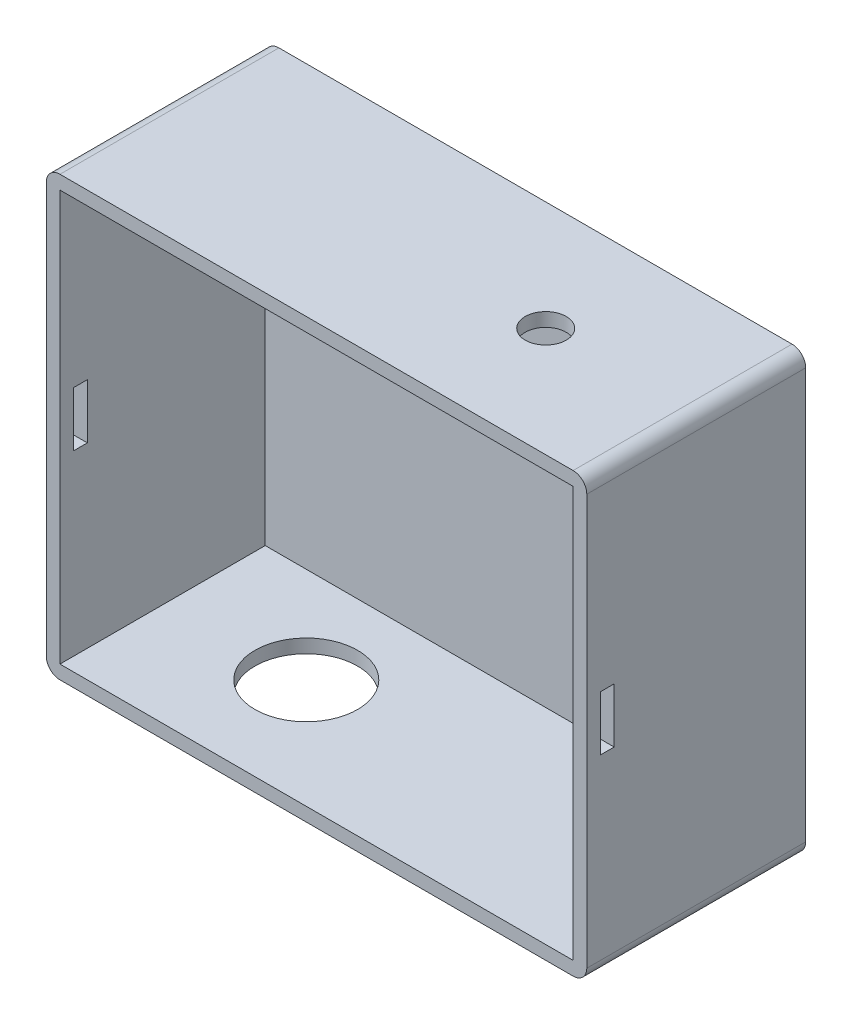
ISO-10303-21;
HEADER;
FILE_DESCRIPTION(('STEP AP214'),'2;1');
FILE_NAME('part.step','',(''),(''),'','','');
FILE_SCHEMA(('AUTOMOTIVE_DESIGN { 1 0 10303 214 1 1 1 1 }'));
ENDSEC;
DATA;
#1=APPLICATION_CONTEXT('core data for automotive mechanical design processes');
#2=APPLICATION_PROTOCOL_DEFINITION('international standard','automotive_design',2000,#1);
#3=PRODUCT_CONTEXT('',#1,'mechanical');
#4=PRODUCT('Part','Part','',(#3));
#5=PRODUCT_RELATED_PRODUCT_CATEGORY('part','',(#4));
#6=PRODUCT_DEFINITION_FORMATION('','',#4);
#7=PRODUCT_DEFINITION_CONTEXT('part definition',#1,'design');
#8=PRODUCT_DEFINITION('design','',#6,#7);
#9=PRODUCT_DEFINITION_SHAPE('','',#8);
#10=(LENGTH_UNIT() NAMED_UNIT(*) SI_UNIT(.MILLI.,.METRE.));
#11=(NAMED_UNIT(*) PLANE_ANGLE_UNIT() SI_UNIT($,.RADIAN.));
#12=(NAMED_UNIT(*) SI_UNIT($,.STERADIAN.) SOLID_ANGLE_UNIT());
#13=UNCERTAINTY_MEASURE_WITH_UNIT(LENGTH_MEASURE(1.E-05),#10,'distance_accuracy_value','');
#14=(GEOMETRIC_REPRESENTATION_CONTEXT(3) GLOBAL_UNCERTAINTY_ASSIGNED_CONTEXT((#13)) GLOBAL_UNIT_ASSIGNED_CONTEXT((#10,
#11,#12)) REPRESENTATION_CONTEXT('',''));
#15=CARTESIAN_POINT('',(0.,0.,0.));
#16=DIRECTION('',(0.,0.,1.));
#17=DIRECTION('',(1.,0.,0.));
#18=AXIS2_PLACEMENT_3D('',#15,#16,#17);
#19=CARTESIAN_POINT('',(0.,0.,30.));
#20=DIRECTION('',(0.,0.,1.));
#21=DIRECTION('',(1.,0.,0.));
#22=AXIS2_PLACEMENT_3D('',#19,#20,#21);
#23=PLANE('',#22);
#24=DIRECTION('',(0.,-1.,0.));
#25=VECTOR('',#24,1.);
#26=CARTESIAN_POINT('',(-39.5,-32.,30.));
#27=LINE('',#26,#25);
#28=CARTESIAN_POINT('',(-39.5,30.,30.));
#29=VERTEX_POINT('',#28);
#30=CARTESIAN_POINT('',(-39.5,-30.,30.));
#31=VERTEX_POINT('',#30);
#32=EDGE_CURVE('E301',#29,#31,#27,.T.);
#33=ORIENTED_EDGE('',*,*,#32,.T.);
#34=CARTESIAN_POINT('',(-37.5,-30.,30.));
#35=DIRECTION('',(0.,0.,1.));
#36=DIRECTION('',(1.,0.,0.));
#37=AXIS2_PLACEMENT_3D('',#34,#35,#36);
#38=CIRCLE('',#37,2.);
#39=CARTESIAN_POINT('',(-37.5,-32.,30.));
#40=VERTEX_POINT('',#39);
#41=EDGE_CURVE('E336',#31,#40,#38,.T.);
#42=ORIENTED_EDGE('',*,*,#41,.T.);
#43=DIRECTION('',(1.,0.,0.));
#44=VECTOR('',#43,1.);
#45=CARTESIAN_POINT('',(-39.5,-32.,30.));
#46=LINE('',#45,#44);
#47=CARTESIAN_POINT('',(37.5,-32.,30.));
#48=VERTEX_POINT('',#47);
#49=EDGE_CURVE('E294',#40,#48,#46,.T.);
#50=ORIENTED_EDGE('',*,*,#49,.T.);
#51=CARTESIAN_POINT('',(37.5,-30.,30.));
#52=DIRECTION('',(0.,0.,1.));
#53=DIRECTION('',(1.,0.,0.));
#54=AXIS2_PLACEMENT_3D('',#51,#52,#53);
#55=CIRCLE('',#54,2.);
#56=CARTESIAN_POINT('',(39.5,-30.,30.));
#57=VERTEX_POINT('',#56);
#58=EDGE_CURVE('E334',#48,#57,#55,.T.);
#59=ORIENTED_EDGE('',*,*,#58,.T.);
#60=DIRECTION('',(0.,1.,0.));
#61=VECTOR('',#60,1.);
#62=CARTESIAN_POINT('',(39.5,-32.,30.));
#63=LINE('',#62,#61);
#64=CARTESIAN_POINT('',(39.5,30.,30.));
#65=VERTEX_POINT('',#64);
#66=EDGE_CURVE('E297',#57,#65,#63,.T.);
#67=ORIENTED_EDGE('',*,*,#66,.T.);
#68=CARTESIAN_POINT('',(37.5,30.,30.));
#69=DIRECTION('',(0.,0.,1.));
#70=DIRECTION('',(1.,0.,0.));
#71=AXIS2_PLACEMENT_3D('',#68,#69,#70);
#72=CIRCLE('',#71,2.);
#73=CARTESIAN_POINT('',(37.5,32.,30.));
#74=VERTEX_POINT('',#73);
#75=EDGE_CURVE('E62',#65,#74,#72,.T.);
#76=ORIENTED_EDGE('',*,*,#75,.T.);
#77=DIRECTION('',(-1.,0.,0.));
#78=VECTOR('',#77,1.);
#79=CARTESIAN_POINT('',(-39.5,32.,30.));
#80=LINE('',#79,#78);
#81=CARTESIAN_POINT('',(-37.5,32.,30.));
#82=VERTEX_POINT('',#81);
#83=EDGE_CURVE('E299',#74,#82,#80,.T.);
#84=ORIENTED_EDGE('',*,*,#83,.T.);
#85=CARTESIAN_POINT('',(-37.5,30.,30.));
#86=DIRECTION('',(0.,0.,1.));
#87=DIRECTION('',(1.,0.,0.));
#88=AXIS2_PLACEMENT_3D('',#85,#86,#87);
#89=CIRCLE('',#88,2.);
#90=EDGE_CURVE('E332',#82,#29,#89,.T.);
#91=ORIENTED_EDGE('',*,*,#90,.T.);
#92=EDGE_LOOP('',(#33,#42,#50,#59,#67,#76,#84,#91));
#93=FACE_BOUND('',#92,.T.);
#94=DIRECTION('',(-1.,0.,0.));
#95=VECTOR('',#94,1.);
#96=CARTESIAN_POINT('',(-37.5,30.,30.));
#97=LINE('',#96,#95);
#98=CARTESIAN_POINT('',(37.5,30.,30.));
#99=VERTEX_POINT('',#98);
#100=CARTESIAN_POINT('',(-37.5,30.,30.));
#101=VERTEX_POINT('',#100);
#102=EDGE_CURVE('E267',#99,#101,#97,.T.);
#103=ORIENTED_EDGE('',*,*,#102,.F.);
#104=DIRECTION('',(0.,1.,0.));
#105=VECTOR('',#104,1.);
#106=CARTESIAN_POINT('',(37.5,-30.,30.));
#107=LINE('',#106,#105);
#108=CARTESIAN_POINT('',(37.5,-30.,30.));
#109=VERTEX_POINT('',#108);
#110=EDGE_CURVE('E265',#109,#99,#107,.T.);
#111=ORIENTED_EDGE('',*,*,#110,.F.);
#112=DIRECTION('',(1.,0.,0.));
#113=VECTOR('',#112,1.);
#114=CARTESIAN_POINT('',(-37.5,-30.,30.));
#115=LINE('',#114,#113);
#116=CARTESIAN_POINT('',(-37.5,-30.,30.));
#117=VERTEX_POINT('',#116);
#118=EDGE_CURVE('E273',#117,#109,#115,.T.);
#119=ORIENTED_EDGE('',*,*,#118,.F.);
#120=DIRECTION('',(0.,-1.,0.));
#121=VECTOR('',#120,1.);
#122=CARTESIAN_POINT('',(-37.5,-30.,30.));
#123=LINE('',#122,#121);
#124=EDGE_CURVE('E270',#101,#117,#123,.T.);
#125=ORIENTED_EDGE('',*,*,#124,.F.);
#126=EDGE_LOOP('',(#103,#111,#119,#125));
#127=FACE_BOUND('',#126,.T.);
#128=ADVANCED_FACE('F42',(#93,#127),#23,.T.);
#129=CARTESIAN_POINT('',(-39.5,-32.,30.));
#130=DIRECTION('',(0.,1.,0.));
#131=DIRECTION('',(0.,0.,1.));
#132=AXIS2_PLACEMENT_3D('',#129,#130,#131);
#133=PLANE('',#132);
#134=CARTESIAN_POINT('',(-17.5,-32.,14.));
#135=DIRECTION('',(0.,1.,0.));
#136=DIRECTION('',(0.,0.,1.));
#137=AXIS2_PLACEMENT_3D('',#134,#135,#136);
#138=CIRCLE('',#137,7.5);
#139=CARTESIAN_POINT('',(-17.5,-32.,21.5));
#140=VERTEX_POINT('',#139);
#141=EDGE_CURVE('E244',#140,#140,#138,.T.);
#142=ORIENTED_EDGE('',*,*,#141,.T.);
#143=EDGE_LOOP('',(#142));
#144=FACE_BOUND('',#143,.T.);
#145=ORIENTED_EDGE('',*,*,#49,.F.);
#146=DIRECTION('',(0.,0.,-1.));
#147=VECTOR('',#146,1.);
#148=CARTESIAN_POINT('',(-37.5,-32.,30.));
#149=LINE('',#148,#147);
#150=CARTESIAN_POINT('',(-37.5,-32.,-2.));
#151=VERTEX_POINT('',#150);
#152=EDGE_CURVE('E315',#40,#151,#149,.T.);
#153=ORIENTED_EDGE('',*,*,#152,.T.);
#154=DIRECTION('',(1.,0.,0.));
#155=VECTOR('',#154,1.);
#156=CARTESIAN_POINT('',(0.,-32.,-2.));
#157=LINE('',#156,#155);
#158=CARTESIAN_POINT('',(37.5,-32.,-2.));
#159=VERTEX_POINT('',#158);
#160=EDGE_CURVE('E255',#151,#159,#157,.T.);
#161=ORIENTED_EDGE('',*,*,#160,.T.);
#162=DIRECTION('',(0.,0.,-1.));
#163=VECTOR('',#162,1.);
#164=CARTESIAN_POINT('',(37.5,-32.,30.));
#165=LINE('',#164,#163);
#166=EDGE_CURVE('E313',#159,#48,#165,.F.);
#167=ORIENTED_EDGE('',*,*,#166,.T.);
#168=EDGE_LOOP('',(#145,#153,#161,#167));
#169=FACE_BOUND('',#168,.T.);
#170=ADVANCED_FACE('F366',(#144,#169),#133,.F.);
#171=CARTESIAN_POINT('',(39.5,-32.,30.));
#172=DIRECTION('',(-1.,0.,0.));
#173=DIRECTION('',(0.,-1.,0.));
#174=AXIS2_PLACEMENT_3D('',#171,#172,#173);
#175=PLANE('',#174);
#176=DIRECTION('',(0.,0.,-1.));
#177=VECTOR('',#176,1.);
#178=CARTESIAN_POINT('',(39.5,-4.00000000000001,26.));
#179=LINE('',#178,#177);
#180=CARTESIAN_POINT('',(39.5,-4.00000000000001,28.));
#181=VERTEX_POINT('',#180);
#182=CARTESIAN_POINT('',(39.5,-4.00000000000001,26.));
#183=VERTEX_POINT('',#182);
#184=EDGE_CURVE('E195',#181,#183,#179,.T.);
#185=ORIENTED_EDGE('',*,*,#184,.F.);
#186=DIRECTION('',(0.,-1.,0.));
#187=VECTOR('',#186,1.);
#188=CARTESIAN_POINT('',(39.5,-4.00000000000001,28.));
#189=LINE('',#188,#187);
#190=CARTESIAN_POINT('',(39.5,3.99999999999999,28.));
#191=VERTEX_POINT('',#190);
#192=EDGE_CURVE('E201',#191,#181,#189,.T.);
#193=ORIENTED_EDGE('',*,*,#192,.F.);
#194=DIRECTION('',(0.,0.,1.));
#195=VECTOR('',#194,1.);
#196=CARTESIAN_POINT('',(39.5,3.99999999999999,26.));
#197=LINE('',#196,#195);
#198=CARTESIAN_POINT('',(39.5,3.99999999999999,26.));
#199=VERTEX_POINT('',#198);
#200=EDGE_CURVE('E206',#199,#191,#197,.T.);
#201=ORIENTED_EDGE('',*,*,#200,.F.);
#202=DIRECTION('',(0.,1.,0.));
#203=VECTOR('',#202,1.);
#204=CARTESIAN_POINT('',(39.5,-4.00000000000001,26.));
#205=LINE('',#204,#203);
#206=EDGE_CURVE('E184',#183,#199,#205,.T.);
#207=ORIENTED_EDGE('',*,*,#206,.F.);
#208=EDGE_LOOP('',(#185,#193,#201,#207));
#209=FACE_BOUND('',#208,.T.);
#210=ORIENTED_EDGE('',*,*,#66,.F.);
#211=DIRECTION('',(0.,0.,-1.));
#212=VECTOR('',#211,1.);
#213=CARTESIAN_POINT('',(39.5,-30.,30.));
#214=LINE('',#213,#212);
#215=CARTESIAN_POINT('',(39.5,-30.,-2.));
#216=VERTEX_POINT('',#215);
#217=EDGE_CURVE('E340',#57,#216,#214,.T.);
#218=ORIENTED_EDGE('',*,*,#217,.T.);
#219=DIRECTION('',(0.,1.,0.));
#220=VECTOR('',#219,1.);
#221=CARTESIAN_POINT('',(39.5,0.,-2.));
#222=LINE('',#221,#220);
#223=CARTESIAN_POINT('',(39.5,30.,-2.));
#224=VERTEX_POINT('',#223);
#225=EDGE_CURVE('E258',#216,#224,#222,.T.);
#226=ORIENTED_EDGE('',*,*,#225,.T.);
#227=DIRECTION('',(0.,0.,-1.));
#228=VECTOR('',#227,1.);
#229=CARTESIAN_POINT('',(39.5,30.,30.));
#230=LINE('',#229,#228);
#231=EDGE_CURVE('E338',#224,#65,#230,.F.);
#232=ORIENTED_EDGE('',*,*,#231,.T.);
#233=EDGE_LOOP('',(#210,#218,#226,#232));
#234=FACE_BOUND('',#233,.T.);
#235=ADVANCED_FACE('F203',(#209,#234),#175,.F.);
#236=CARTESIAN_POINT('',(-39.5,32.,30.));
#237=DIRECTION('',(0.,-1.,0.));
#238=DIRECTION('',(0.,0.,-1.));
#239=AXIS2_PLACEMENT_3D('',#236,#237,#238);
#240=PLANE('',#239);
#241=CARTESIAN_POINT('',(17.5,32.,14.));
#242=DIRECTION('',(0.,-1.,0.));
#243=DIRECTION('',(0.,0.,-1.));
#244=AXIS2_PLACEMENT_3D('',#241,#242,#243);
#245=CIRCLE('',#244,3.);
#246=CARTESIAN_POINT('',(17.5,32.,11.));
#247=VERTEX_POINT('',#246);
#248=EDGE_CURVE('E240',#247,#247,#245,.T.);
#249=ORIENTED_EDGE('',*,*,#248,.T.);
#250=EDGE_LOOP('',(#249));
#251=FACE_BOUND('',#250,.T.);
#252=DIRECTION('',(1.,0.,0.));
#253=VECTOR('',#252,1.);
#254=CARTESIAN_POINT('',(0.,32.,-2.));
#255=LINE('',#254,#253);
#256=CARTESIAN_POINT('',(-37.5,32.,-2.));
#257=VERTEX_POINT('',#256);
#258=CARTESIAN_POINT('',(37.5,32.,-2.));
#259=VERTEX_POINT('',#258);
#260=EDGE_CURVE('E261',#257,#259,#255,.T.);
#261=ORIENTED_EDGE('',*,*,#260,.F.);
#262=DIRECTION('',(0.,0.,-1.));
#263=VECTOR('',#262,1.);
#264=CARTESIAN_POINT('',(-37.5,32.,30.));
#265=LINE('',#264,#263);
#266=EDGE_CURVE('E11',#257,#82,#265,.F.);
#267=ORIENTED_EDGE('',*,*,#266,.T.);
#268=ORIENTED_EDGE('',*,*,#83,.F.);
#269=DIRECTION('',(0.,0.,-1.));
#270=VECTOR('',#269,1.);
#271=CARTESIAN_POINT('',(37.5,32.,30.));
#272=LINE('',#271,#270);
#273=EDGE_CURVE('E50',#74,#259,#272,.T.);
#274=ORIENTED_EDGE('',*,*,#273,.T.);
#275=EDGE_LOOP('',(#261,#267,#268,#274));
#276=FACE_BOUND('',#275,.T.);
#277=ADVANCED_FACE('F344',(#251,#276),#240,.F.);
#278=CARTESIAN_POINT('',(-39.5,-32.,30.));
#279=DIRECTION('',(1.,0.,0.));
#280=DIRECTION('',(0.,0.,-1.));
#281=AXIS2_PLACEMENT_3D('',#278,#279,#280);
#282=PLANE('',#281);
#283=DIRECTION('',(0.,0.,1.));
#284=VECTOR('',#283,1.);
#285=CARTESIAN_POINT('',(-39.5,3.99999999999999,26.));
#286=LINE('',#285,#284);
#287=CARTESIAN_POINT('',(-39.5,3.99999999999999,26.));
#288=VERTEX_POINT('',#287);
#289=CARTESIAN_POINT('',(-39.5,3.99999999999999,28.));
#290=VERTEX_POINT('',#289);
#291=EDGE_CURVE('E220',#288,#290,#286,.T.);
#292=ORIENTED_EDGE('',*,*,#291,.T.);
#293=DIRECTION('',(0.,-1.,0.));
#294=VECTOR('',#293,1.);
#295=CARTESIAN_POINT('',(-39.5,-4.00000000000001,28.));
#296=LINE('',#295,#294);
#297=CARTESIAN_POINT('',(-39.5,-4.00000000000001,28.));
#298=VERTEX_POINT('',#297);
#299=EDGE_CURVE('E208',#290,#298,#296,.T.);
#300=ORIENTED_EDGE('',*,*,#299,.T.);
#301=DIRECTION('',(0.,0.,-1.));
#302=VECTOR('',#301,1.);
#303=CARTESIAN_POINT('',(-39.5,-4.00000000000001,26.));
#304=LINE('',#303,#302);
#305=CARTESIAN_POINT('',(-39.5,-4.00000000000001,26.));
#306=VERTEX_POINT('',#305);
#307=EDGE_CURVE('E214',#298,#306,#304,.T.);
#308=ORIENTED_EDGE('',*,*,#307,.T.);
#309=DIRECTION('',(0.,1.,0.));
#310=VECTOR('',#309,1.);
#311=CARTESIAN_POINT('',(-39.5,-4.00000000000001,26.));
#312=LINE('',#311,#310);
#313=EDGE_CURVE('E217',#306,#288,#312,.T.);
#314=ORIENTED_EDGE('',*,*,#313,.T.);
#315=EDGE_LOOP('',(#292,#300,#308,#314));
#316=FACE_BOUND('',#315,.T.);
#317=DIRECTION('',(0.,1.,0.));
#318=VECTOR('',#317,1.);
#319=CARTESIAN_POINT('',(-39.5,0.,-2.));
#320=LINE('',#319,#318);
#321=CARTESIAN_POINT('',(-39.5,-30.,-2.));
#322=VERTEX_POINT('',#321);
#323=CARTESIAN_POINT('',(-39.5,30.,-2.));
#324=VERTEX_POINT('',#323);
#325=EDGE_CURVE('E250',#322,#324,#320,.T.);
#326=ORIENTED_EDGE('',*,*,#325,.F.);
#327=DIRECTION('',(0.,0.,-1.));
#328=VECTOR('',#327,1.);
#329=CARTESIAN_POINT('',(-39.5,-30.,30.));
#330=LINE('',#329,#328);
#331=EDGE_CURVE('E329',#322,#31,#330,.F.);
#332=ORIENTED_EDGE('',*,*,#331,.T.);
#333=ORIENTED_EDGE('',*,*,#32,.F.);
#334=DIRECTION('',(0.,0.,-1.));
#335=VECTOR('',#334,1.);
#336=CARTESIAN_POINT('',(-39.5,30.,30.));
#337=LINE('',#336,#335);
#338=EDGE_CURVE('E326',#29,#324,#337,.T.);
#339=ORIENTED_EDGE('',*,*,#338,.T.);
#340=EDGE_LOOP('',(#326,#332,#333,#339));
#341=FACE_BOUND('',#340,.T.);
#342=ADVANCED_FACE('F357',(#316,#341),#282,.F.);
#343=CARTESIAN_POINT('',(37.5,-30.,30.));
#344=DIRECTION('',(-1.,0.,0.));
#345=DIRECTION('',(0.,0.,1.));
#346=AXIS2_PLACEMENT_3D('',#343,#344,#345);
#347=PLANE('',#346);
#348=DIRECTION('',(0.,1.,0.));
#349=VECTOR('',#348,1.);
#350=CARTESIAN_POINT('',(37.5,-30.,28.));
#351=LINE('',#350,#349);
#352=CARTESIAN_POINT('',(37.5,-4.00000000000001,28.));
#353=VERTEX_POINT('',#352);
#354=CARTESIAN_POINT('',(37.5,3.99999999999999,28.));
#355=VERTEX_POINT('',#354);
#356=EDGE_CURVE('E238',#353,#355,#351,.T.);
#357=ORIENTED_EDGE('',*,*,#356,.F.);
#358=DIRECTION('',(0.,0.,1.));
#359=VECTOR('',#358,1.);
#360=CARTESIAN_POINT('',(37.5,-4.00000000000001,30.));
#361=LINE('',#360,#359);
#362=CARTESIAN_POINT('',(37.5,-4.00000000000001,26.));
#363=VERTEX_POINT('',#362);
#364=EDGE_CURVE('E226',#363,#353,#361,.T.);
#365=ORIENTED_EDGE('',*,*,#364,.F.);
#366=DIRECTION('',(0.,-1.,0.));
#367=VECTOR('',#366,1.);
#368=CARTESIAN_POINT('',(37.5,-30.,26.));
#369=LINE('',#368,#367);
#370=CARTESIAN_POINT('',(37.5,3.99999999999999,26.));
#371=VERTEX_POINT('',#370);
#372=EDGE_CURVE('E187',#371,#363,#369,.T.);
#373=ORIENTED_EDGE('',*,*,#372,.F.);
#374=DIRECTION('',(0.,0.,-1.));
#375=VECTOR('',#374,1.);
#376=CARTESIAN_POINT('',(37.5,3.99999999999999,30.));
#377=LINE('',#376,#375);
#378=EDGE_CURVE('E236',#355,#371,#377,.T.);
#379=ORIENTED_EDGE('',*,*,#378,.F.);
#380=EDGE_LOOP('',(#357,#365,#373,#379));
#381=FACE_BOUND('',#380,.T.);
#382=DIRECTION('',(0.,1.,0.));
#383=VECTOR('',#382,1.);
#384=CARTESIAN_POINT('',(37.5,-30.,0.));
#385=LINE('',#384,#383);
#386=CARTESIAN_POINT('',(37.5,-30.,0.));
#387=VERTEX_POINT('',#386);
#388=CARTESIAN_POINT('',(37.5,30.,0.));
#389=VERTEX_POINT('',#388);
#390=EDGE_CURVE('E264',#387,#389,#385,.T.);
#391=ORIENTED_EDGE('',*,*,#390,.F.);
#392=DIRECTION('',(0.,0.,-1.));
#393=VECTOR('',#392,1.);
#394=CARTESIAN_POINT('',(37.5,-30.,30.));
#395=LINE('',#394,#393);
#396=EDGE_CURVE('E275',#109,#387,#395,.T.);
#397=ORIENTED_EDGE('',*,*,#396,.F.);
#398=ORIENTED_EDGE('',*,*,#110,.T.);
#399=DIRECTION('',(0.,0.,-1.));
#400=VECTOR('',#399,1.);
#401=CARTESIAN_POINT('',(37.5,30.,30.));
#402=LINE('',#401,#400);
#403=EDGE_CURVE('E291',#99,#389,#402,.T.);
#404=ORIENTED_EDGE('',*,*,#403,.T.);
#405=EDGE_LOOP('',(#391,#397,#398,#404));
#406=FACE_BOUND('',#405,.T.);
#407=ADVANCED_FACE('F388',(#381,#406),#347,.T.);
#408=CARTESIAN_POINT('',(-37.5,30.,30.));
#409=DIRECTION('',(0.,-1.,0.));
#410=DIRECTION('',(0.,0.,-1.));
#411=AXIS2_PLACEMENT_3D('',#408,#409,#410);
#412=PLANE('',#411);
#413=CARTESIAN_POINT('',(17.5,30.,14.));
#414=DIRECTION('',(0.,-1.,0.));
#415=DIRECTION('',(0.,0.,-1.));
#416=AXIS2_PLACEMENT_3D('',#413,#414,#415);
#417=CIRCLE('',#416,3.);
#418=CARTESIAN_POINT('',(17.5,30.,11.));
#419=VERTEX_POINT('',#418);
#420=EDGE_CURVE('E241',#419,#419,#417,.T.);
#421=ORIENTED_EDGE('',*,*,#420,.F.);
#422=EDGE_LOOP('',(#421));
#423=FACE_BOUND('',#422,.T.);
#424=DIRECTION('',(-1.,0.,0.));
#425=VECTOR('',#424,1.);
#426=CARTESIAN_POINT('',(-37.5,30.,0.));
#427=LINE('',#426,#425);
#428=CARTESIAN_POINT('',(-37.5,30.,0.));
#429=VERTEX_POINT('',#428);
#430=EDGE_CURVE('E278',#389,#429,#427,.T.);
#431=ORIENTED_EDGE('',*,*,#430,.F.);
#432=ORIENTED_EDGE('',*,*,#403,.F.);
#433=ORIENTED_EDGE('',*,*,#102,.T.);
#434=DIRECTION('',(0.,0.,-1.));
#435=VECTOR('',#434,1.);
#436=CARTESIAN_POINT('',(-37.5,30.,30.));
#437=LINE('',#436,#435);
#438=EDGE_CURVE('E289',#101,#429,#437,.T.);
#439=ORIENTED_EDGE('',*,*,#438,.T.);
#440=EDGE_LOOP('',(#431,#432,#433,#439));
#441=FACE_BOUND('',#440,.T.);
#442=ADVANCED_FACE('F537',(#423,#441),#412,.T.);
#443=CARTESIAN_POINT('',(-37.5,-30.,30.));
#444=DIRECTION('',(1.,0.,0.));
#445=DIRECTION('',(0.,0.,-1.));
#446=AXIS2_PLACEMENT_3D('',#443,#444,#445);
#447=PLANE('',#446);
#448=DIRECTION('',(0.,-1.,0.));
#449=VECTOR('',#448,1.);
#450=CARTESIAN_POINT('',(-37.5,-30.,28.));
#451=LINE('',#450,#449);
#452=CARTESIAN_POINT('',(-37.5,3.99999999999999,28.));
#453=VERTEX_POINT('',#452);
#454=CARTESIAN_POINT('',(-37.5,-4.00000000000001,28.));
#455=VERTEX_POINT('',#454);
#456=EDGE_CURVE('E310',#453,#455,#451,.T.);
#457=ORIENTED_EDGE('',*,*,#456,.F.);
#458=DIRECTION('',(0.,0.,1.));
#459=VECTOR('',#458,1.);
#460=CARTESIAN_POINT('',(-37.5,3.99999999999999,30.));
#461=LINE('',#460,#459);
#462=CARTESIAN_POINT('',(-37.5,3.99999999999999,26.));
#463=VERTEX_POINT('',#462);
#464=EDGE_CURVE('E308',#463,#453,#461,.T.);
#465=ORIENTED_EDGE('',*,*,#464,.F.);
#466=DIRECTION('',(0.,1.,0.));
#467=VECTOR('',#466,1.);
#468=CARTESIAN_POINT('',(-37.5,-30.,26.));
#469=LINE('',#468,#467);
#470=CARTESIAN_POINT('',(-37.5,-4.00000000000001,26.));
#471=VERTEX_POINT('',#470);
#472=EDGE_CURVE('E306',#471,#463,#469,.T.);
#473=ORIENTED_EDGE('',*,*,#472,.F.);
#474=DIRECTION('',(0.,0.,-1.));
#475=VECTOR('',#474,1.);
#476=CARTESIAN_POINT('',(-37.5,-4.00000000000001,30.));
#477=LINE('',#476,#475);
#478=EDGE_CURVE('E304',#455,#471,#477,.T.);
#479=ORIENTED_EDGE('',*,*,#478,.F.);
#480=EDGE_LOOP('',(#457,#465,#473,#479));
#481=FACE_BOUND('',#480,.T.);
#482=DIRECTION('',(0.,-1.,0.));
#483=VECTOR('',#482,1.);
#484=CARTESIAN_POINT('',(-37.5,-30.,0.));
#485=LINE('',#484,#483);
#486=CARTESIAN_POINT('',(-37.5,-30.,0.));
#487=VERTEX_POINT('',#486);
#488=EDGE_CURVE('E281',#429,#487,#485,.T.);
#489=ORIENTED_EDGE('',*,*,#488,.F.);
#490=ORIENTED_EDGE('',*,*,#438,.F.);
#491=ORIENTED_EDGE('',*,*,#124,.T.);
#492=DIRECTION('',(0.,0.,-1.));
#493=VECTOR('',#492,1.);
#494=CARTESIAN_POINT('',(-37.5,-30.,30.));
#495=LINE('',#494,#493);
#496=EDGE_CURVE('E287',#117,#487,#495,.T.);
#497=ORIENTED_EDGE('',*,*,#496,.T.);
#498=EDGE_LOOP('',(#489,#490,#491,#497));
#499=FACE_BOUND('',#498,.T.);
#500=ADVANCED_FACE('F527',(#481,#499),#447,.T.);
#501=CARTESIAN_POINT('',(-37.5,-30.,30.));
#502=DIRECTION('',(0.,1.,0.));
#503=DIRECTION('',(0.,0.,1.));
#504=AXIS2_PLACEMENT_3D('',#501,#502,#503);
#505=PLANE('',#504);
#506=CARTESIAN_POINT('',(-17.5,-30.,14.));
#507=DIRECTION('',(0.,1.,0.));
#508=DIRECTION('',(0.,0.,1.));
#509=AXIS2_PLACEMENT_3D('',#506,#507,#508);
#510=CIRCLE('',#509,7.5);
#511=CARTESIAN_POINT('',(-17.5,-30.,21.5));
#512=VERTEX_POINT('',#511);
#513=EDGE_CURVE('E247',#512,#512,#510,.T.);
#514=ORIENTED_EDGE('',*,*,#513,.F.);
#515=EDGE_LOOP('',(#514));
#516=FACE_BOUND('',#515,.T.);
#517=DIRECTION('',(1.,0.,0.));
#518=VECTOR('',#517,1.);
#519=CARTESIAN_POINT('',(-37.5,-30.,0.));
#520=LINE('',#519,#518);
#521=EDGE_CURVE('E268',#487,#387,#520,.T.);
#522=ORIENTED_EDGE('',*,*,#521,.F.);
#523=ORIENTED_EDGE('',*,*,#496,.F.);
#524=ORIENTED_EDGE('',*,*,#118,.T.);
#525=ORIENTED_EDGE('',*,*,#396,.T.);
#526=EDGE_LOOP('',(#522,#523,#524,#525));
#527=FACE_BOUND('',#526,.T.);
#528=ADVANCED_FACE('F517',(#516,#527),#505,.T.);
#529=CARTESIAN_POINT('',(0.,0.,0.));
#530=DIRECTION('',(0.,0.,1.));
#531=DIRECTION('',(1.,0.,0.));
#532=AXIS2_PLACEMENT_3D('',#529,#530,#531);
#533=PLANE('',#532);
#534=ORIENTED_EDGE('',*,*,#521,.T.);
#535=ORIENTED_EDGE('',*,*,#390,.T.);
#536=ORIENTED_EDGE('',*,*,#430,.T.);
#537=ORIENTED_EDGE('',*,*,#488,.T.);
#538=EDGE_LOOP('',(#534,#535,#536,#537));
#539=FACE_BOUND('',#538,.T.);
#540=ADVANCED_FACE('F509',(#539),#533,.T.);
#541=CARTESIAN_POINT('',(0.,0.,-2.));
#542=DIRECTION('',(0.,0.,1.));
#543=DIRECTION('',(1.,0.,0.));
#544=AXIS2_PLACEMENT_3D('',#541,#542,#543);
#545=PLANE('',#544);
#546=ORIENTED_EDGE('',*,*,#160,.F.);
#547=CARTESIAN_POINT('',(-37.5,-30.,-2.));
#548=DIRECTION('',(0.,0.,1.));
#549=DIRECTION('',(1.,0.,0.));
#550=AXIS2_PLACEMENT_3D('',#547,#548,#549);
#551=CIRCLE('',#550,2.);
#552=EDGE_CURVE('E324',#151,#322,#551,.F.);
#553=ORIENTED_EDGE('',*,*,#552,.T.);
#554=ORIENTED_EDGE('',*,*,#325,.T.);
#555=CARTESIAN_POINT('',(-37.5,30.,-2.));
#556=DIRECTION('',(0.,0.,1.));
#557=DIRECTION('',(1.,0.,0.));
#558=AXIS2_PLACEMENT_3D('',#555,#556,#557);
#559=CIRCLE('',#558,2.);
#560=EDGE_CURVE('E320',#324,#257,#559,.F.);
#561=ORIENTED_EDGE('',*,*,#560,.T.);
#562=ORIENTED_EDGE('',*,*,#260,.T.);
#563=CARTESIAN_POINT('',(37.5,30.,-2.));
#564=DIRECTION('',(0.,0.,1.));
#565=DIRECTION('',(1.,0.,0.));
#566=AXIS2_PLACEMENT_3D('',#563,#564,#565);
#567=CIRCLE('',#566,2.);
#568=EDGE_CURVE('E318',#259,#224,#567,.F.);
#569=ORIENTED_EDGE('',*,*,#568,.T.);
#570=ORIENTED_EDGE('',*,*,#225,.F.);
#571=CARTESIAN_POINT('',(37.5,-30.,-2.));
#572=DIRECTION('',(0.,0.,1.));
#573=DIRECTION('',(1.,0.,0.));
#574=AXIS2_PLACEMENT_3D('',#571,#572,#573);
#575=CIRCLE('',#574,2.);
#576=EDGE_CURVE('E322',#216,#159,#575,.F.);
#577=ORIENTED_EDGE('',*,*,#576,.T.);
#578=EDGE_LOOP('',(#546,#553,#554,#561,#562,#569,#570,#577));
#579=FACE_BOUND('',#578,.T.);
#580=ADVANCED_FACE('F348',(#579),#545,.F.);
#581=CARTESIAN_POINT('',(-17.5,-30.,14.));
#582=DIRECTION('',(0.,-1.,0.));
#583=DIRECTION('',(0.,0.,-1.));
#584=AXIS2_PLACEMENT_3D('',#581,#582,#583);
#585=CYLINDRICAL_SURFACE('',#584,7.5);
#586=ORIENTED_EDGE('',*,*,#513,.T.);
#587=EDGE_LOOP('',(#586));
#588=FACE_BOUND('',#587,.T.);
#589=ORIENTED_EDGE('',*,*,#141,.F.);
#590=EDGE_LOOP('',(#589));
#591=FACE_BOUND('',#590,.T.);
#592=ADVANCED_FACE('F493',(#588,#591),#585,.F.);
#593=CARTESIAN_POINT('',(17.5,30.,14.));
#594=DIRECTION('',(0.,1.,0.));
#595=DIRECTION('',(0.,0.,1.));
#596=AXIS2_PLACEMENT_3D('',#593,#594,#595);
#597=CYLINDRICAL_SURFACE('',#596,3.);
#598=ORIENTED_EDGE('',*,*,#420,.T.);
#599=EDGE_LOOP('',(#598));
#600=FACE_BOUND('',#599,.T.);
#601=ORIENTED_EDGE('',*,*,#248,.F.);
#602=EDGE_LOOP('',(#601));
#603=FACE_BOUND('',#602,.T.);
#604=ADVANCED_FACE('F485',(#600,#603),#597,.F.);
#605=CARTESIAN_POINT('',(-39.5,-4.00000000000001,26.));
#606=DIRECTION('',(0.,-1.,0.));
#607=DIRECTION('',(0.,0.,-1.));
#608=AXIS2_PLACEMENT_3D('',#605,#606,#607);
#609=PLANE('',#608);
#610=ORIENTED_EDGE('',*,*,#478,.T.);
#611=DIRECTION('',(1.,0.,0.));
#612=VECTOR('',#611,1.);
#613=CARTESIAN_POINT('',(-39.5,-4.00000000000001,26.));
#614=LINE('',#613,#612);
#615=EDGE_CURVE('E190',#306,#471,#614,.T.);
#616=ORIENTED_EDGE('',*,*,#615,.F.);
#617=ORIENTED_EDGE('',*,*,#307,.F.);
#618=DIRECTION('',(1.,0.,0.));
#619=VECTOR('',#618,1.);
#620=CARTESIAN_POINT('',(-39.5,-4.00000000000001,28.));
#621=LINE('',#620,#619);
#622=EDGE_CURVE('E191',#298,#455,#621,.T.);
#623=ORIENTED_EDGE('',*,*,#622,.T.);
#624=EDGE_LOOP('',(#610,#616,#617,#623));
#625=FACE_BOUND('',#624,.T.);
#626=ADVANCED_FACE('F429',(#625),#609,.F.);
#627=CARTESIAN_POINT('',(-39.5,-4.00000000000001,26.));
#628=DIRECTION('',(0.,0.,-1.));
#629=DIRECTION('',(-1.,0.,0.));
#630=AXIS2_PLACEMENT_3D('',#627,#628,#629);
#631=PLANE('',#630);
#632=ORIENTED_EDGE('',*,*,#472,.T.);
#633=DIRECTION('',(1.,0.,0.));
#634=VECTOR('',#633,1.);
#635=CARTESIAN_POINT('',(-39.5,3.99999999999999,26.));
#636=LINE('',#635,#634);
#637=EDGE_CURVE('E228',#288,#463,#636,.T.);
#638=ORIENTED_EDGE('',*,*,#637,.F.);
#639=ORIENTED_EDGE('',*,*,#313,.F.);
#640=ORIENTED_EDGE('',*,*,#615,.T.);
#641=EDGE_LOOP('',(#632,#638,#639,#640));
#642=FACE_BOUND('',#641,.T.);
#643=ADVANCED_FACE('F438',(#642),#631,.F.);
#644=CARTESIAN_POINT('',(-39.5,3.99999999999999,26.));
#645=DIRECTION('',(0.,1.,0.));
#646=DIRECTION('',(0.,0.,1.));
#647=AXIS2_PLACEMENT_3D('',#644,#645,#646);
#648=PLANE('',#647);
#649=ORIENTED_EDGE('',*,*,#464,.T.);
#650=DIRECTION('',(1.,0.,0.));
#651=VECTOR('',#650,1.);
#652=CARTESIAN_POINT('',(-39.5,3.99999999999999,28.));
#653=LINE('',#652,#651);
#654=EDGE_CURVE('E223',#290,#453,#653,.T.);
#655=ORIENTED_EDGE('',*,*,#654,.F.);
#656=ORIENTED_EDGE('',*,*,#291,.F.);
#657=ORIENTED_EDGE('',*,*,#637,.T.);
#658=EDGE_LOOP('',(#649,#655,#656,#657));
#659=FACE_BOUND('',#658,.T.);
#660=ADVANCED_FACE('F448',(#659),#648,.F.);
#661=CARTESIAN_POINT('',(-39.5,-4.00000000000001,28.));
#662=DIRECTION('',(0.,0.,1.));
#663=DIRECTION('',(1.,0.,0.));
#664=AXIS2_PLACEMENT_3D('',#661,#662,#663);
#665=PLANE('',#664);
#666=ORIENTED_EDGE('',*,*,#456,.T.);
#667=ORIENTED_EDGE('',*,*,#622,.F.);
#668=ORIENTED_EDGE('',*,*,#299,.F.);
#669=ORIENTED_EDGE('',*,*,#654,.T.);
#670=EDGE_LOOP('',(#666,#667,#668,#669));
#671=FACE_BOUND('',#670,.T.);
#672=ADVANCED_FACE('F455',(#671),#665,.F.);
#673=ORIENTED_EDGE('',*,*,#356,.T.);
#674=EDGE_CURVE('E227',#355,#191,#653,.T.);
#675=ORIENTED_EDGE('',*,*,#674,.T.);
#676=ORIENTED_EDGE('',*,*,#192,.T.);
#677=EDGE_CURVE('E198',#353,#181,#621,.T.);
#678=ORIENTED_EDGE('',*,*,#677,.F.);
#679=EDGE_LOOP('',(#673,#675,#676,#678));
#680=FACE_BOUND('',#679,.T.);
#681=ADVANCED_FACE('F445',(#680),#665,.F.);
#682=ORIENTED_EDGE('',*,*,#378,.T.);
#683=EDGE_CURVE('E230',#371,#199,#636,.T.);
#684=ORIENTED_EDGE('',*,*,#683,.T.);
#685=ORIENTED_EDGE('',*,*,#200,.T.);
#686=ORIENTED_EDGE('',*,*,#674,.F.);
#687=EDGE_LOOP('',(#682,#684,#685,#686));
#688=FACE_BOUND('',#687,.T.);
#689=ADVANCED_FACE('F436',(#688),#648,.F.);
#690=ORIENTED_EDGE('',*,*,#372,.T.);
#691=EDGE_CURVE('E179',#363,#183,#614,.T.);
#692=ORIENTED_EDGE('',*,*,#691,.T.);
#693=ORIENTED_EDGE('',*,*,#206,.T.);
#694=ORIENTED_EDGE('',*,*,#683,.F.);
#695=EDGE_LOOP('',(#690,#692,#693,#694));
#696=FACE_BOUND('',#695,.T.);
#697=ADVANCED_FACE('F181',(#696),#631,.F.);
#698=ORIENTED_EDGE('',*,*,#364,.T.);
#699=ORIENTED_EDGE('',*,*,#677,.T.);
#700=ORIENTED_EDGE('',*,*,#184,.T.);
#701=ORIENTED_EDGE('',*,*,#691,.F.);
#702=EDGE_LOOP('',(#698,#699,#700,#701));
#703=FACE_BOUND('',#702,.T.);
#704=ADVANCED_FACE('F196',(#703),#609,.F.);
#705=CARTESIAN_POINT('',(-37.5,-30.,30.));
#706=DIRECTION('',(0.,0.,-1.));
#707=DIRECTION('',(-1.,0.,0.));
#708=AXIS2_PLACEMENT_3D('',#705,#706,#707);
#709=CYLINDRICAL_SURFACE('',#708,2.);
#710=ORIENTED_EDGE('',*,*,#41,.F.);
#711=ORIENTED_EDGE('',*,*,#331,.F.);
#712=ORIENTED_EDGE('',*,*,#552,.F.);
#713=ORIENTED_EDGE('',*,*,#152,.F.);
#714=EDGE_LOOP('',(#710,#711,#712,#713));
#715=FACE_BOUND('',#714,.T.);
#716=ADVANCED_FACE('F364',(#715),#709,.T.);
#717=CARTESIAN_POINT('',(37.5,-30.,30.));
#718=DIRECTION('',(0.,0.,-1.));
#719=DIRECTION('',(-1.,0.,0.));
#720=AXIS2_PLACEMENT_3D('',#717,#718,#719);
#721=CYLINDRICAL_SURFACE('',#720,2.);
#722=ORIENTED_EDGE('',*,*,#58,.F.);
#723=ORIENTED_EDGE('',*,*,#166,.F.);
#724=ORIENTED_EDGE('',*,*,#576,.F.);
#725=ORIENTED_EDGE('',*,*,#217,.F.);
#726=EDGE_LOOP('',(#722,#723,#724,#725));
#727=FACE_BOUND('',#726,.T.);
#728=ADVANCED_FACE('F371',(#727),#721,.T.);
#729=CARTESIAN_POINT('',(-37.5,30.,30.));
#730=DIRECTION('',(0.,0.,-1.));
#731=DIRECTION('',(-1.,0.,0.));
#732=AXIS2_PLACEMENT_3D('',#729,#730,#731);
#733=CYLINDRICAL_SURFACE('',#732,2.);
#734=ORIENTED_EDGE('',*,*,#90,.F.);
#735=ORIENTED_EDGE('',*,*,#266,.F.);
#736=ORIENTED_EDGE('',*,*,#560,.F.);
#737=ORIENTED_EDGE('',*,*,#338,.F.);
#738=EDGE_LOOP('',(#734,#735,#736,#737));
#739=FACE_BOUND('',#738,.T.);
#740=ADVANCED_FACE('F354',(#739),#733,.T.);
#741=CARTESIAN_POINT('',(37.5,30.,30.));
#742=DIRECTION('',(0.,0.,-1.));
#743=DIRECTION('',(-1.,0.,0.));
#744=AXIS2_PLACEMENT_3D('',#741,#742,#743);
#745=CYLINDRICAL_SURFACE('',#744,2.);
#746=ORIENTED_EDGE('',*,*,#75,.F.);
#747=ORIENTED_EDGE('',*,*,#231,.F.);
#748=ORIENTED_EDGE('',*,*,#568,.F.);
#749=ORIENTED_EDGE('',*,*,#273,.F.);
#750=EDGE_LOOP('',(#746,#747,#748,#749));
#751=FACE_BOUND('',#750,.T.);
#752=ADVANCED_FACE('F44',(#751),#745,.T.);
#753=CLOSED_SHELL('',(#128,#170,#235,#277,#342,#407,#442,#500,#528,#540,#580,#592,#604,#626,
#643,#660,#672,#681,#689,#697,#704,#716,#728,#740,#752));
#754=MANIFOLD_SOLID_BREP('B2',#753);
#755=ADVANCED_BREP_SHAPE_REPRESENTATION('',(#18,#754),#14);
#756=SHAPE_DEFINITION_REPRESENTATION(#9,#755);
ENDSEC;
END-ISO-10303-21;
